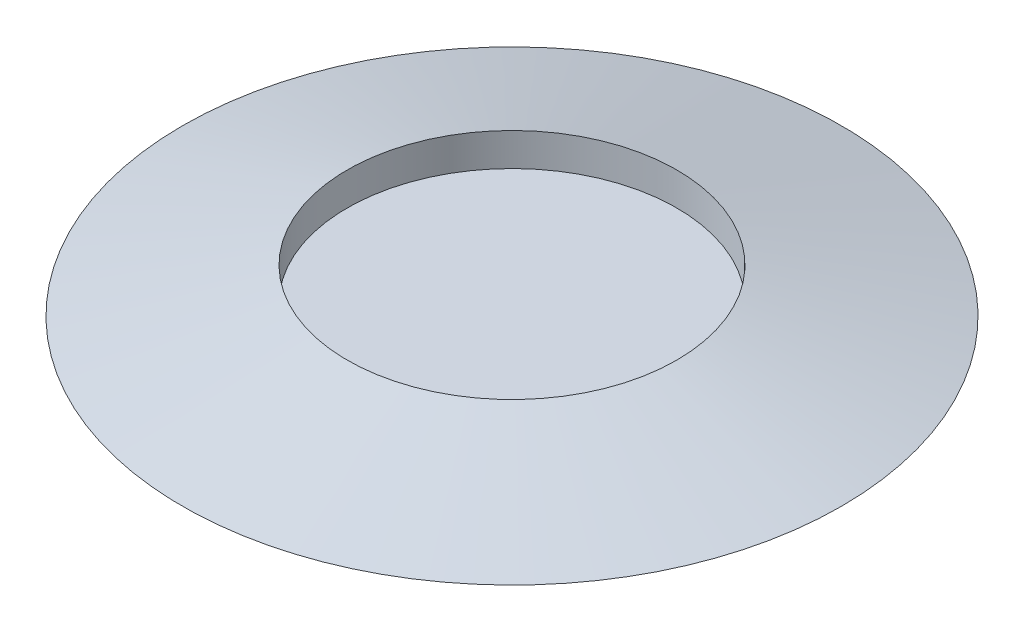
ISO-10303-21;
HEADER;
FILE_DESCRIPTION(('STEP AP214'),'2;1');
FILE_NAME('part.step','',(''),(''),'','','');
FILE_SCHEMA(('AUTOMOTIVE_DESIGN { 1 0 10303 214 1 1 1 1 }'));
ENDSEC;
DATA;
#1=APPLICATION_CONTEXT('core data for automotive mechanical design processes');
#2=APPLICATION_PROTOCOL_DEFINITION('international standard','automotive_design',2000,#1);
#3=PRODUCT_CONTEXT('',#1,'mechanical');
#4=PRODUCT('Part','Part','',(#3));
#5=PRODUCT_RELATED_PRODUCT_CATEGORY('part','',(#4));
#6=PRODUCT_DEFINITION_FORMATION('','',#4);
#7=PRODUCT_DEFINITION_CONTEXT('part definition',#1,'design');
#8=PRODUCT_DEFINITION('design','',#6,#7);
#9=PRODUCT_DEFINITION_SHAPE('','',#8);
#10=(LENGTH_UNIT() NAMED_UNIT(*) SI_UNIT(.MILLI.,.METRE.));
#11=(NAMED_UNIT(*) PLANE_ANGLE_UNIT() SI_UNIT($,.RADIAN.));
#12=(NAMED_UNIT(*) SI_UNIT($,.STERADIAN.) SOLID_ANGLE_UNIT());
#13=UNCERTAINTY_MEASURE_WITH_UNIT(LENGTH_MEASURE(1.E-05),#10,'distance_accuracy_value','');
#14=(GEOMETRIC_REPRESENTATION_CONTEXT(3) GLOBAL_UNCERTAINTY_ASSIGNED_CONTEXT((#13)) GLOBAL_UNIT_ASSIGNED_CONTEXT((#10,
#11,#12)) REPRESENTATION_CONTEXT('',''));
#15=CARTESIAN_POINT('',(0.,0.,0.));
#16=DIRECTION('',(0.,0.,1.));
#17=DIRECTION('',(1.,0.,0.));
#18=AXIS2_PLACEMENT_3D('',#15,#16,#17);
#19=CARTESIAN_POINT('',(0.,6.79491924311159,0.));
#20=DIRECTION('',(0.,1.,0.));
#21=DIRECTION('',(-1.,0.,0.));
#22=AXIS2_PLACEMENT_3D('',#19,#20,#21);
#23=PLANE('',#22);
#24=CARTESIAN_POINT('',(0.,6.79491924311159,0.));
#25=DIRECTION('',(0.,-1.,0.));
#26=DIRECTION('',(1.,0.,0.));
#27=AXIS2_PLACEMENT_3D('',#24,#25,#26);
#28=CIRCLE('',#27,100.);
#29=CARTESIAN_POINT('',(100.,6.79491924311159,0.));
#30=VERTEX_POINT('',#29);
#31=EDGE_CURVE('E10',#30,#30,#28,.T.);
#32=ORIENTED_EDGE('',*,*,#31,.F.);
#33=EDGE_LOOP('',(#32));
#34=FACE_BOUND('',#33,.T.);
#35=ADVANCED_FACE('F37',(#34),#23,.T.);
#36=CARTESIAN_POINT('',(0.,0.,0.));
#37=DIRECTION('',(0.,-1.,0.));
#38=DIRECTION('',(1.,0.,0.));
#39=AXIS2_PLACEMENT_3D('',#36,#37,#38);
#40=CYLINDRICAL_SURFACE('',#39,100.);
#41=ORIENTED_EDGE('',*,*,#31,.T.);
#42=EDGE_LOOP('',(#41));
#43=FACE_BOUND('',#42,.T.);
#44=CARTESIAN_POINT('',(0.,26.7949192431116,0.));
#45=DIRECTION('',(0.,-1.,0.));
#46=DIRECTION('',(1.,0.,0.));
#47=AXIS2_PLACEMENT_3D('',#44,#45,#46);
#48=CIRCLE('',#47,100.);
#49=CARTESIAN_POINT('',(100.,26.7949192431116,0.));
#50=VERTEX_POINT('',#49);
#51=EDGE_CURVE('E43',#50,#50,#48,.T.);
#52=ORIENTED_EDGE('',*,*,#51,.F.);
#53=EDGE_LOOP('',(#52));
#54=FACE_BOUND('',#53,.T.);
#55=ADVANCED_FACE('F58',(#43,#54),#40,.F.);
#56=CARTESIAN_POINT('',(0.,26.7949192431116,0.));
#57=DIRECTION('',(0.,-1.,0.));
#58=DIRECTION('',(1.,0.,0.));
#59=AXIS2_PLACEMENT_3D('',#56,#57,#58);
#60=CONICAL_SURFACE('',#59,100.,1.30899693899575);
#61=CARTESIAN_POINT('',(0.,0.,0.));
#62=DIRECTION('',(0.,-1.,0.));
#63=DIRECTION('',(1.,0.,0.));
#64=AXIS2_PLACEMENT_3D('',#61,#62,#63);
#65=CIRCLE('',#64,200.);
#66=CARTESIAN_POINT('',(200.,0.,0.));
#67=VERTEX_POINT('',#66);
#68=EDGE_CURVE('E47',#67,#67,#65,.T.);
#69=ORIENTED_EDGE('',*,*,#68,.F.);
#70=EDGE_LOOP('',(#69));
#71=FACE_BOUND('',#70,.T.);
#72=ORIENTED_EDGE('',*,*,#51,.T.);
#73=EDGE_LOOP('',(#72));
#74=FACE_BOUND('',#73,.T.);
#75=ADVANCED_FACE('F56',(#71,#74),#60,.T.);
#76=CARTESIAN_POINT('',(0.,0.,0.));
#77=DIRECTION('',(0.,1.,0.));
#78=DIRECTION('',(-1.,0.,0.));
#79=AXIS2_PLACEMENT_3D('',#76,#77,#78);
#80=PLANE('',#79);
#81=ORIENTED_EDGE('',*,*,#68,.T.);
#82=EDGE_LOOP('',(#81));
#83=FACE_BOUND('',#82,.T.);
#84=ADVANCED_FACE('F54',(#83),#80,.F.);
#85=CLOSED_SHELL('',(#35,#55,#75,#84));
#86=MANIFOLD_SOLID_BREP('B2',#85);
#87=ADVANCED_BREP_SHAPE_REPRESENTATION('',(#18,#86),#14);
#88=SHAPE_DEFINITION_REPRESENTATION(#9,#87);
ENDSEC;
END-ISO-10303-21;
